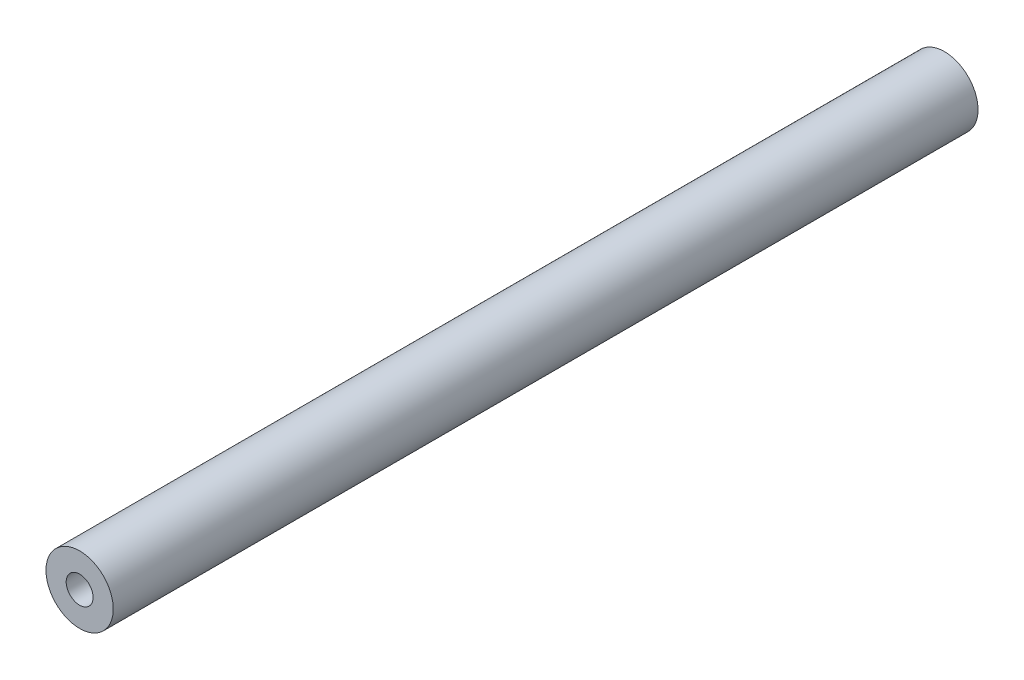
ISO-10303-21;
HEADER;
FILE_DESCRIPTION(('STEP AP214'),'2;1');
FILE_NAME('part.step','',(''),(''),'','','');
FILE_SCHEMA(('AUTOMOTIVE_DESIGN { 1 0 10303 214 1 1 1 1 }'));
ENDSEC;
DATA;
#1=APPLICATION_CONTEXT('core data for automotive mechanical design processes');
#2=APPLICATION_PROTOCOL_DEFINITION('international standard','automotive_design',2000,#1);
#3=PRODUCT_CONTEXT('',#1,'mechanical');
#4=PRODUCT('Part','Part','',(#3));
#5=PRODUCT_RELATED_PRODUCT_CATEGORY('part','',(#4));
#6=PRODUCT_DEFINITION_FORMATION('','',#4);
#7=PRODUCT_DEFINITION_CONTEXT('part definition',#1,'design');
#8=PRODUCT_DEFINITION('design','',#6,#7);
#9=PRODUCT_DEFINITION_SHAPE('','',#8);
#10=(LENGTH_UNIT() NAMED_UNIT(*) SI_UNIT(.MILLI.,.METRE.));
#11=(NAMED_UNIT(*) PLANE_ANGLE_UNIT() SI_UNIT($,.RADIAN.));
#12=(NAMED_UNIT(*) SI_UNIT($,.STERADIAN.) SOLID_ANGLE_UNIT());
#13=UNCERTAINTY_MEASURE_WITH_UNIT(LENGTH_MEASURE(1.E-05),#10,'distance_accuracy_value','');
#14=(GEOMETRIC_REPRESENTATION_CONTEXT(3) GLOBAL_UNCERTAINTY_ASSIGNED_CONTEXT((#13)) GLOBAL_UNIT_ASSIGNED_CONTEXT((#10,
#11,#12)) REPRESENTATION_CONTEXT('',''));
#15=CARTESIAN_POINT('',(0.,0.,0.));
#16=DIRECTION('',(0.,0.,1.));
#17=DIRECTION('',(1.,0.,0.));
#18=AXIS2_PLACEMENT_3D('',#15,#16,#17);
#19=CARTESIAN_POINT('',(0.,0.,90.));
#20=DIRECTION('',(0.,0.,-1.));
#21=DIRECTION('',(-1.,0.,0.));
#22=AXIS2_PLACEMENT_3D('',#19,#20,#21);
#23=CYLINDRICAL_SURFACE('',#22,3.5);
#24=CARTESIAN_POINT('',(0.,0.,90.));
#25=DIRECTION('',(0.,0.,1.));
#26=DIRECTION('',(1.,0.,0.));
#27=AXIS2_PLACEMENT_3D('',#24,#25,#26);
#28=CIRCLE('',#27,3.5);
#29=CARTESIAN_POINT('',(-3.5,0.,90.));
#30=VERTEX_POINT('',#29);
#31=EDGE_CURVE('E10',#30,#30,#28,.T.);
#32=CARTESIAN_POINT('',(0.,0.,0.));
#33=DIRECTION('',(0.,0.,1.));
#34=DIRECTION('',(1.,0.,0.));
#35=AXIS2_PLACEMENT_3D('',#32,#33,#34);
#36=CIRCLE('',#35,3.5);
#37=CARTESIAN_POINT('',(-3.5,0.,0.));
#38=VERTEX_POINT('',#37);
#39=EDGE_CURVE('E40',#38,#38,#36,.T.);
#40=CARTESIAN_POINT('',(-3.5,0.,90.));
#41=CARTESIAN_POINT('',(-3.5,0.,89.0625));
#42=CARTESIAN_POINT('',(-3.5,0.,88.125));
#43=CARTESIAN_POINT('',(-3.5,0.,86.25));
#44=CARTESIAN_POINT('',(-3.5,0.,85.3125));
#45=CARTESIAN_POINT('',(-3.5,0.,83.4375));
#46=CARTESIAN_POINT('',(-3.5,0.,82.5));
#47=CARTESIAN_POINT('',(-3.5,0.,80.625));
#48=CARTESIAN_POINT('',(-3.5,0.,79.6875));
#49=CARTESIAN_POINT('',(-3.5,0.,77.8125));
#50=CARTESIAN_POINT('',(-3.5,0.,76.875));
#51=CARTESIAN_POINT('',(-3.5,0.,75.));
#52=CARTESIAN_POINT('',(-3.5,0.,74.0625));
#53=CARTESIAN_POINT('',(-3.5,0.,72.1875));
#54=CARTESIAN_POINT('',(-3.5,0.,71.25));
#55=CARTESIAN_POINT('',(-3.5,0.,69.375));
#56=CARTESIAN_POINT('',(-3.5,0.,68.4375));
#57=CARTESIAN_POINT('',(-3.5,0.,66.5625));
#58=CARTESIAN_POINT('',(-3.5,0.,65.625));
#59=CARTESIAN_POINT('',(-3.5,0.,63.75));
#60=CARTESIAN_POINT('',(-3.5,0.,62.8125));
#61=CARTESIAN_POINT('',(-3.5,0.,60.9375));
#62=CARTESIAN_POINT('',(-3.5,0.,60.));
#63=CARTESIAN_POINT('',(-3.5,0.,58.125));
#64=CARTESIAN_POINT('',(-3.5,0.,57.1875));
#65=CARTESIAN_POINT('',(-3.5,0.,55.3125));
#66=CARTESIAN_POINT('',(-3.5,0.,54.375));
#67=CARTESIAN_POINT('',(-3.5,0.,52.5));
#68=CARTESIAN_POINT('',(-3.5,0.,51.5625));
#69=CARTESIAN_POINT('',(-3.5,0.,49.6875));
#70=CARTESIAN_POINT('',(-3.5,0.,48.75));
#71=CARTESIAN_POINT('',(-3.5,0.,46.875));
#72=CARTESIAN_POINT('',(-3.5,0.,45.9375));
#73=CARTESIAN_POINT('',(-3.5,0.,44.0625));
#74=CARTESIAN_POINT('',(-3.5,0.,43.125));
#75=CARTESIAN_POINT('',(-3.5,0.,41.25));
#76=CARTESIAN_POINT('',(-3.5,0.,40.3125));
#77=CARTESIAN_POINT('',(-3.5,0.,38.4375));
#78=CARTESIAN_POINT('',(-3.5,0.,37.5));
#79=CARTESIAN_POINT('',(-3.5,0.,35.625));
#80=CARTESIAN_POINT('',(-3.5,0.,34.6875));
#81=CARTESIAN_POINT('',(-3.5,0.,32.8125));
#82=CARTESIAN_POINT('',(-3.5,0.,31.875));
#83=CARTESIAN_POINT('',(-3.5,0.,30.));
#84=CARTESIAN_POINT('',(-3.5,0.,29.0625));
#85=CARTESIAN_POINT('',(-3.5,0.,27.1875));
#86=CARTESIAN_POINT('',(-3.5,0.,26.25));
#87=CARTESIAN_POINT('',(-3.5,0.,24.375));
#88=CARTESIAN_POINT('',(-3.5,0.,23.4375));
#89=CARTESIAN_POINT('',(-3.5,0.,21.5625));
#90=CARTESIAN_POINT('',(-3.5,0.,20.625));
#91=CARTESIAN_POINT('',(-3.5,0.,18.75));
#92=CARTESIAN_POINT('',(-3.5,0.,17.8125));
#93=CARTESIAN_POINT('',(-3.5,0.,15.9375));
#94=CARTESIAN_POINT('',(-3.5,0.,15.));
#95=CARTESIAN_POINT('',(-3.5,0.,13.125));
#96=CARTESIAN_POINT('',(-3.5,0.,12.1875));
#97=CARTESIAN_POINT('',(-3.5,0.,10.3125));
#98=CARTESIAN_POINT('',(-3.5,0.,9.37499999999999));
#99=CARTESIAN_POINT('',(-3.5,0.,7.49999999999999));
#100=CARTESIAN_POINT('',(-3.5,0.,6.56249999999999));
#101=CARTESIAN_POINT('',(-3.5,0.,4.68749999999999));
#102=CARTESIAN_POINT('',(-3.5,0.,3.74999999999998));
#103=CARTESIAN_POINT('',(-3.5,0.,1.87499999999998));
#104=CARTESIAN_POINT('',(-3.5,0.,0.937499999999986));
#105=CARTESIAN_POINT('',(-3.5,0.,0.));
#106=B_SPLINE_CURVE_WITH_KNOTS('',3,(#40,#41,#42,#43,#44,#45,#46,#47,#48,#49,#50,#51,#52,#53,
#54,#55,#56,#57,#58,#59,#60,#61,#62,#63,#64,#65,#66,#67,#68,#69,#70,#71,#72,#73,#74,#75,#76,#77,
#78,#79,#80,#81,#82,#83,#84,#85,#86,#87,#88,#89,#90,#91,#92,#93,#94,#95,#96,#97,#98,#99,#100,
#101,#102,#103,#104,#105),.UNSPECIFIED.,.F.,.F.,(4,2,2,2,2,2,2,2,2,2,2,2,2,2,2,2,2,2,2,2,2,2,2,
2,2,2,2,2,2,2,2,2,4),(0.,2.8125,5.62499999999999,8.43749999999999,11.25,14.0625,16.875,19.6875,
22.5,25.3125,28.125,30.9375,33.75,36.5625,39.375,42.1875,45.,47.8125,50.625,53.4375,56.25,
59.0625,61.875,64.6875,67.5,70.3125,73.125,75.9375,78.75,81.5625,84.375,87.1875,90.),.UNSPECIFIED.);
#107=EDGE_CURVE('BSEAM37',#30,#38,#106,.T.);
#108=ORIENTED_EDGE('',*,*,#31,.F.);
#109=ORIENTED_EDGE('',*,*,#39,.T.);
#110=ORIENTED_EDGE('',*,*,#107,.T.);
#111=ORIENTED_EDGE('',*,*,#107,.F.);
#112=EDGE_LOOP('',(#108,#110,#109,#111));
#113=FACE_BOUND('',#112,.T.);
#114=ADVANCED_FACE('F37',(#113),#23,.T.);
#115=CARTESIAN_POINT('',(0.,0.,90.));
#116=DIRECTION('',(0.,0.,1.));
#117=DIRECTION('',(1.,0.,0.));
#118=AXIS2_PLACEMENT_3D('',#115,#116,#117);
#119=PLANE('',#118);
#120=CARTESIAN_POINT('',(0.,0.,90.));
#121=DIRECTION('',(0.,0.,1.));
#122=DIRECTION('',(1.,0.,0.));
#123=AXIS2_PLACEMENT_3D('',#120,#121,#122);
#124=CIRCLE('',#123,1.4);
#125=CARTESIAN_POINT('',(1.4,0.,90.));
#126=VERTEX_POINT('',#125);
#127=EDGE_CURVE('E51',#126,#126,#124,.T.);
#128=ORIENTED_EDGE('',*,*,#127,.F.);
#129=EDGE_LOOP('',(#128));
#130=FACE_BOUND('',#129,.T.);
#131=ORIENTED_EDGE('',*,*,#31,.T.);
#132=EDGE_LOOP('',(#131));
#133=FACE_BOUND('',#132,.T.);
#134=ADVANCED_FACE('F80',(#130,#133),#119,.T.);
#135=CARTESIAN_POINT('',(0.,0.,0.));
#136=DIRECTION('',(0.,0.,1.));
#137=DIRECTION('',(1.,0.,0.));
#138=AXIS2_PLACEMENT_3D('',#135,#136,#137);
#139=PLANE('',#138);
#140=CARTESIAN_POINT('',(0.,0.,0.));
#141=DIRECTION('',(0.,0.,-1.));
#142=DIRECTION('',(-1.,0.,0.));
#143=AXIS2_PLACEMENT_3D('',#140,#141,#142);
#144=CIRCLE('',#143,1.4);
#145=CARTESIAN_POINT('',(-1.4,0.,0.));
#146=VERTEX_POINT('',#145);
#147=EDGE_CURVE('E59',#146,#146,#144,.T.);
#148=ORIENTED_EDGE('',*,*,#147,.F.);
#149=EDGE_LOOP('',(#148));
#150=FACE_BOUND('',#149,.T.);
#151=ORIENTED_EDGE('',*,*,#39,.F.);
#152=EDGE_LOOP('',(#151));
#153=FACE_BOUND('',#152,.T.);
#154=ADVANCED_FACE('F76',(#150,#153),#139,.F.);
#155=CARTESIAN_POINT('',(0.,0.,80.));
#156=DIRECTION('',(0.,0.,1.));
#157=DIRECTION('',(1.,0.,0.));
#158=AXIS2_PLACEMENT_3D('',#155,#156,#157);
#159=CYLINDRICAL_SURFACE('',#158,1.4);
#160=CARTESIAN_POINT('',(0.,0.,80.));
#161=DIRECTION('',(0.,0.,1.));
#162=DIRECTION('',(1.,0.,0.));
#163=AXIS2_PLACEMENT_3D('',#160,#161,#162);
#164=CIRCLE('',#163,1.4);
#165=CARTESIAN_POINT('',(1.4,0.,80.));
#166=VERTEX_POINT('',#165);
#167=EDGE_CURVE('E49',#166,#166,#164,.T.);
#168=ORIENTED_EDGE('',*,*,#167,.F.);
#169=EDGE_LOOP('',(#168));
#170=FACE_BOUND('',#169,.T.);
#171=ORIENTED_EDGE('',*,*,#127,.T.);
#172=EDGE_LOOP('',(#171));
#173=FACE_BOUND('',#172,.T.);
#174=ADVANCED_FACE('F79',(#170,#173),#159,.F.);
#175=CARTESIAN_POINT('',(0.,0.,80.));
#176=DIRECTION('',(0.,0.,1.));
#177=DIRECTION('',(1.,0.,0.));
#178=AXIS2_PLACEMENT_3D('',#175,#176,#177);
#179=PLANE('',#178);
#180=ORIENTED_EDGE('',*,*,#167,.T.);
#181=EDGE_LOOP('',(#180));
#182=FACE_BOUND('',#181,.T.);
#183=ADVANCED_FACE('F72',(#182),#179,.T.);
#184=CARTESIAN_POINT('',(0.,0.,10.));
#185=DIRECTION('',(0.,0.,-1.));
#186=DIRECTION('',(-1.,0.,0.));
#187=AXIS2_PLACEMENT_3D('',#184,#185,#186);
#188=CYLINDRICAL_SURFACE('',#187,1.4);
#189=CARTESIAN_POINT('',(0.,0.,10.));
#190=DIRECTION('',(0.,0.,-1.));
#191=DIRECTION('',(-1.,0.,0.));
#192=AXIS2_PLACEMENT_3D('',#189,#190,#191);
#193=CIRCLE('',#192,1.4);
#194=CARTESIAN_POINT('',(-1.4,0.,10.));
#195=VERTEX_POINT('',#194);
#196=EDGE_CURVE('E55',#195,#195,#193,.T.);
#197=ORIENTED_EDGE('',*,*,#196,.F.);
#198=EDGE_LOOP('',(#197));
#199=FACE_BOUND('',#198,.T.);
#200=ORIENTED_EDGE('',*,*,#147,.T.);
#201=EDGE_LOOP('',(#200));
#202=FACE_BOUND('',#201,.T.);
#203=ADVANCED_FACE('F69',(#199,#202),#188,.F.);
#204=CARTESIAN_POINT('',(0.,0.,10.));
#205=DIRECTION('',(0.,0.,-1.));
#206=DIRECTION('',(-1.,0.,0.));
#207=AXIS2_PLACEMENT_3D('',#204,#205,#206);
#208=PLANE('',#207);
#209=ORIENTED_EDGE('',*,*,#196,.T.);
#210=EDGE_LOOP('',(#209));
#211=FACE_BOUND('',#210,.T.);
#212=ADVANCED_FACE('F67',(#211),#208,.T.);
#213=CLOSED_SHELL('',(#114,#134,#154,#174,#183,#203,#212));
#214=MANIFOLD_SOLID_BREP('B2',#213);
#215=ADVANCED_BREP_SHAPE_REPRESENTATION('',(#18,#214),#14);
#216=SHAPE_DEFINITION_REPRESENTATION(#9,#215);
ENDSEC;
END-ISO-10303-21;
